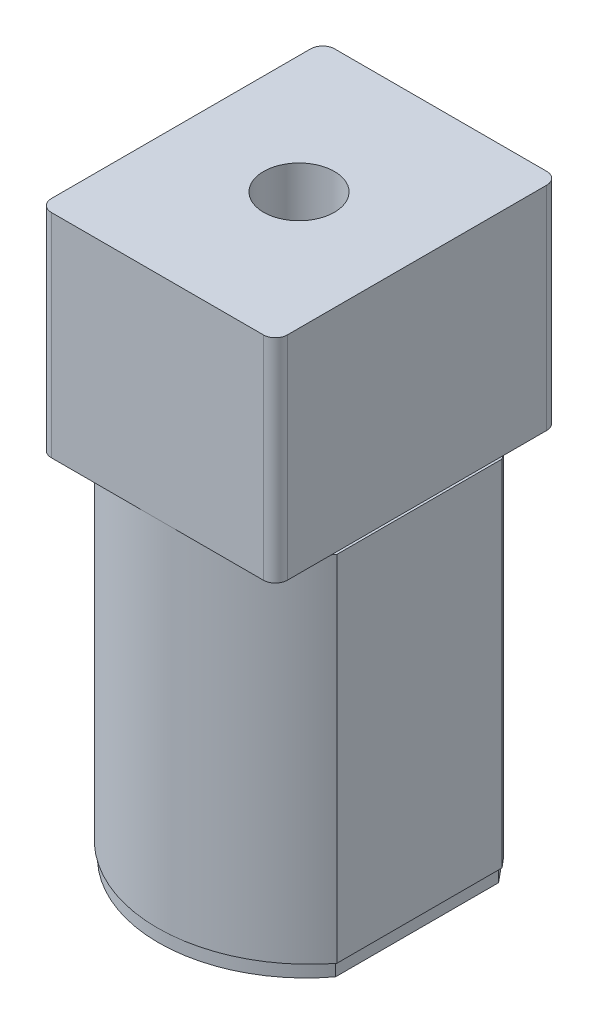
ISO-10303-21;
HEADER;
FILE_DESCRIPTION(('STEP AP214'),'2;1');
FILE_NAME('part.step','',(''),(''),'','','');
FILE_SCHEMA(('AUTOMOTIVE_DESIGN { 1 0 10303 214 1 1 1 1 }'));
ENDSEC;
DATA;
#1=APPLICATION_CONTEXT('core data for automotive mechanical design processes');
#2=APPLICATION_PROTOCOL_DEFINITION('international standard','automotive_design',2000,#1);
#3=PRODUCT_CONTEXT('',#1,'mechanical');
#4=PRODUCT('Part','Part','',(#3));
#5=PRODUCT_RELATED_PRODUCT_CATEGORY('part','',(#4));
#6=PRODUCT_DEFINITION_FORMATION('','',#4);
#7=PRODUCT_DEFINITION_CONTEXT('part definition',#1,'design');
#8=PRODUCT_DEFINITION('design','',#6,#7);
#9=PRODUCT_DEFINITION_SHAPE('','',#8);
#10=(LENGTH_UNIT() NAMED_UNIT(*) SI_UNIT(.MILLI.,.METRE.));
#11=(NAMED_UNIT(*) PLANE_ANGLE_UNIT() SI_UNIT($,.RADIAN.));
#12=(NAMED_UNIT(*) SI_UNIT($,.STERADIAN.) SOLID_ANGLE_UNIT());
#13=UNCERTAINTY_MEASURE_WITH_UNIT(LENGTH_MEASURE(1.E-05),#10,'distance_accuracy_value','');
#14=(GEOMETRIC_REPRESENTATION_CONTEXT(3) GLOBAL_UNCERTAINTY_ASSIGNED_CONTEXT((#13)) GLOBAL_UNIT_ASSIGNED_CONTEXT((#10,
#11,#12)) REPRESENTATION_CONTEXT('',''));
#15=CARTESIAN_POINT('',(0.,0.,0.));
#16=DIRECTION('',(0.,0.,1.));
#17=DIRECTION('',(1.,0.,0.));
#18=AXIS2_PLACEMENT_3D('',#15,#16,#17);
#19=CARTESIAN_POINT('',(0.,15.,0.));
#20=DIRECTION('',(0.,1.,0.));
#21=DIRECTION('',(0.,0.,1.));
#22=AXIS2_PLACEMENT_3D('',#19,#20,#21);
#23=PLANE('',#22);
#24=DIRECTION('',(0.,0.,-1.));
#25=VECTOR('',#24,1.);
#26=CARTESIAN_POINT('',(5.,15.,6.));
#27=LINE('',#26,#25);
#28=CARTESIAN_POINT('',(5.,15.,3.62578174992238));
#29=VERTEX_POINT('',#28);
#30=CARTESIAN_POINT('',(5.,15.,-3.62578174992237));
#31=VERTEX_POINT('',#30);
#32=EDGE_CURVE('E223',#29,#31,#27,.T.);
#33=ORIENTED_EDGE('',*,*,#32,.F.);
#34=CARTESIAN_POINT('',(0.,15.,-0.452));
#35=DIRECTION('',(0.,1.,0.));
#36=DIRECTION('',(0.,0.,1.));
#37=AXIS2_PLACEMENT_3D('',#34,#35,#36);
#38=CIRCLE('',#37,6.452);
#39=CARTESIAN_POINT('',(5.1,15.,3.5));
#40=VERTEX_POINT('',#39);
#41=EDGE_CURVE('E236',#29,#40,#38,.T.);
#42=ORIENTED_EDGE('',*,*,#41,.T.);
#43=DIRECTION('',(0.,0.,-1.));
#44=VECTOR('',#43,1.);
#45=CARTESIAN_POINT('',(5.1,15.,0.));
#46=LINE('',#45,#44);
#47=CARTESIAN_POINT('',(5.1,15.,-3.5));
#48=VERTEX_POINT('',#47);
#49=EDGE_CURVE('E234',#40,#48,#46,.T.);
#50=ORIENTED_EDGE('',*,*,#49,.T.);
#51=CARTESIAN_POINT('',(0.,15.,0.451999999999997));
#52=DIRECTION('',(0.,1.,0.));
#53=DIRECTION('',(0.,0.,1.));
#54=AXIS2_PLACEMENT_3D('',#51,#52,#53);
#55=CIRCLE('',#54,6.452);
#56=EDGE_CURVE('E239',#31,#48,#55,.F.);
#57=ORIENTED_EDGE('',*,*,#56,.F.);
#58=EDGE_LOOP('',(#33,#42,#50,#57));
#59=FACE_BOUND('',#58,.T.);
#60=ADVANCED_FACE('F37',(#59),#23,.T.);
#61=CARTESIAN_POINT('',(0.,15.,-0.452));
#62=DIRECTION('',(0.,-1.,0.));
#63=DIRECTION('',(0.,0.,-1.));
#64=AXIS2_PLACEMENT_3D('',#61,#62,#63);
#65=CYLINDRICAL_SURFACE('',#64,6.452);
#66=CARTESIAN_POINT('',(0.,0.,-0.452));
#67=DIRECTION('',(0.,1.,0.));
#68=DIRECTION('',(0.,0.,1.));
#69=AXIS2_PLACEMENT_3D('',#66,#67,#68);
#70=CIRCLE('',#69,6.452);
#71=CARTESIAN_POINT('',(-5.1,0.,3.5));
#72=VERTEX_POINT('',#71);
#73=CARTESIAN_POINT('',(5.1,0.,3.5));
#74=VERTEX_POINT('',#73);
#75=EDGE_CURVE('E219',#72,#74,#70,.T.);
#76=ORIENTED_EDGE('',*,*,#75,.T.);
#77=DIRECTION('',(0.,-1.,0.));
#78=VECTOR('',#77,1.);
#79=CARTESIAN_POINT('',(5.1,15.,3.5));
#80=LINE('',#79,#78);
#81=EDGE_CURVE('E264',#40,#74,#80,.T.);
#82=ORIENTED_EDGE('',*,*,#81,.F.);
#83=ORIENTED_EDGE('',*,*,#41,.F.);
#84=CARTESIAN_POINT('',(0.,15.,6.));
#85=VERTEX_POINT('',#84);
#86=EDGE_CURVE('E353',#85,#29,#38,.T.);
#87=ORIENTED_EDGE('',*,*,#86,.F.);
#88=CARTESIAN_POINT('',(-5.,15.,3.62578174992237));
#89=VERTEX_POINT('',#88);
#90=EDGE_CURVE('E235',#89,#85,#38,.T.);
#91=ORIENTED_EDGE('',*,*,#90,.F.);
#92=CARTESIAN_POINT('',(-5.1,15.,3.5));
#93=VERTEX_POINT('',#92);
#94=EDGE_CURVE('E232',#93,#89,#38,.T.);
#95=ORIENTED_EDGE('',*,*,#94,.F.);
#96=DIRECTION('',(0.,-1.,0.));
#97=VECTOR('',#96,1.);
#98=CARTESIAN_POINT('',(-5.1,15.,3.5));
#99=LINE('',#98,#97);
#100=EDGE_CURVE('E247',#93,#72,#99,.T.);
#101=ORIENTED_EDGE('',*,*,#100,.T.);
#102=EDGE_LOOP('',(#76,#82,#83,#87,#91,#95,#101));
#103=FACE_BOUND('',#102,.T.);
#104=ADVANCED_FACE('F364',(#103),#65,.T.);
#105=CARTESIAN_POINT('',(5.1,15.,0.));
#106=DIRECTION('',(-1.,0.,0.));
#107=DIRECTION('',(0.,0.,1.));
#108=AXIS2_PLACEMENT_3D('',#105,#106,#107);
#109=PLANE('',#108);
#110=DIRECTION('',(0.,0.,-1.));
#111=VECTOR('',#110,1.);
#112=CARTESIAN_POINT('',(5.1,0.,0.));
#113=LINE('',#112,#111);
#114=CARTESIAN_POINT('',(5.1,0.,-3.5));
#115=VERTEX_POINT('',#114);
#116=EDGE_CURVE('E250',#74,#115,#113,.T.);
#117=ORIENTED_EDGE('',*,*,#116,.T.);
#118=DIRECTION('',(0.,-1.,0.));
#119=VECTOR('',#118,1.);
#120=CARTESIAN_POINT('',(5.1,15.,-3.5));
#121=LINE('',#120,#119);
#122=EDGE_CURVE('E262',#48,#115,#121,.T.);
#123=ORIENTED_EDGE('',*,*,#122,.F.);
#124=ORIENTED_EDGE('',*,*,#49,.F.);
#125=ORIENTED_EDGE('',*,*,#81,.T.);
#126=EDGE_LOOP('',(#117,#123,#124,#125));
#127=FACE_BOUND('',#126,.T.);
#128=ADVANCED_FACE('F363',(#127),#109,.F.);
#129=CARTESIAN_POINT('',(0.,15.,0.451999999999997));
#130=DIRECTION('',(0.,-1.,0.));
#131=DIRECTION('',(0.,0.,-1.));
#132=AXIS2_PLACEMENT_3D('',#129,#130,#131);
#133=CYLINDRICAL_SURFACE('',#132,6.452);
#134=CARTESIAN_POINT('',(0.,0.,0.451999999999997));
#135=DIRECTION('',(0.,1.,0.));
#136=DIRECTION('',(0.,0.,1.));
#137=AXIS2_PLACEMENT_3D('',#134,#135,#136);
#138=CIRCLE('',#137,6.452);
#139=CARTESIAN_POINT('',(-5.1,0.,-3.5));
#140=VERTEX_POINT('',#139);
#141=EDGE_CURVE('E253',#140,#115,#138,.F.);
#142=ORIENTED_EDGE('',*,*,#141,.F.);
#143=DIRECTION('',(0.,-1.,0.));
#144=VECTOR('',#143,1.);
#145=CARTESIAN_POINT('',(-5.1,15.,-3.5));
#146=LINE('',#145,#144);
#147=CARTESIAN_POINT('',(-5.1,15.,-3.5));
#148=VERTEX_POINT('',#147);
#149=EDGE_CURVE('E260',#148,#140,#146,.T.);
#150=ORIENTED_EDGE('',*,*,#149,.F.);
#151=CARTESIAN_POINT('',(-5.,15.,-3.62578174992237));
#152=VERTEX_POINT('',#151);
#153=EDGE_CURVE('E240',#148,#152,#55,.F.);
#154=ORIENTED_EDGE('',*,*,#153,.T.);
#155=CARTESIAN_POINT('',(0.,15.,-6.));
#156=VERTEX_POINT('',#155);
#157=EDGE_CURVE('E244',#152,#156,#55,.F.);
#158=ORIENTED_EDGE('',*,*,#157,.T.);
#159=EDGE_CURVE('E379',#156,#31,#55,.F.);
#160=ORIENTED_EDGE('',*,*,#159,.T.);
#161=ORIENTED_EDGE('',*,*,#56,.T.);
#162=ORIENTED_EDGE('',*,*,#122,.T.);
#163=EDGE_LOOP('',(#142,#150,#154,#158,#160,#161,#162));
#164=FACE_BOUND('',#163,.T.);
#165=ADVANCED_FACE('F376',(#164),#133,.T.);
#166=CARTESIAN_POINT('',(-5.1,15.,0.));
#167=DIRECTION('',(-1.,0.,0.));
#168=DIRECTION('',(0.,0.,1.));
#169=AXIS2_PLACEMENT_3D('',#166,#167,#168);
#170=PLANE('',#169);
#171=DIRECTION('',(0.,0.,-1.));
#172=VECTOR('',#171,1.);
#173=CARTESIAN_POINT('',(-5.1,0.,0.));
#174=LINE('',#173,#172);
#175=EDGE_CURVE('E256',#72,#140,#174,.T.);
#176=ORIENTED_EDGE('',*,*,#175,.F.);
#177=ORIENTED_EDGE('',*,*,#100,.F.);
#178=DIRECTION('',(0.,0.,-1.));
#179=VECTOR('',#178,1.);
#180=CARTESIAN_POINT('',(-5.1,15.,0.));
#181=LINE('',#180,#179);
#182=EDGE_CURVE('E243',#93,#148,#181,.T.);
#183=ORIENTED_EDGE('',*,*,#182,.T.);
#184=ORIENTED_EDGE('',*,*,#149,.T.);
#185=EDGE_LOOP('',(#176,#177,#183,#184));
#186=FACE_BOUND('',#185,.T.);
#187=ADVANCED_FACE('F371',(#186),#170,.T.);
#188=DIRECTION('',(0.,0.,1.));
#189=VECTOR('',#188,1.);
#190=CARTESIAN_POINT('',(-5.,15.,6.));
#191=LINE('',#190,#189);
#192=EDGE_CURVE('E230',#152,#89,#191,.T.);
#193=ORIENTED_EDGE('',*,*,#192,.F.);
#194=ORIENTED_EDGE('',*,*,#153,.F.);
#195=ORIENTED_EDGE('',*,*,#182,.F.);
#196=ORIENTED_EDGE('',*,*,#94,.T.);
#197=EDGE_LOOP('',(#193,#194,#195,#196));
#198=FACE_BOUND('',#197,.T.);
#199=ADVANCED_FACE('F385',(#198),#23,.T.);
#200=CARTESIAN_POINT('',(0.,0.,0.));
#201=DIRECTION('',(0.,1.,0.));
#202=DIRECTION('',(0.,0.,1.));
#203=AXIS2_PLACEMENT_3D('',#200,#201,#202);
#204=PLANE('',#203);
#205=DIRECTION('',(0.,0.,1.));
#206=VECTOR('',#205,1.);
#207=CARTESIAN_POINT('',(-5.,0.,0.));
#208=LINE('',#207,#206);
#209=CARTESIAN_POINT('',(-5.,0.,-3.45));
#210=VERTEX_POINT('',#209);
#211=CARTESIAN_POINT('',(-5.,0.,3.45));
#212=VERTEX_POINT('',#211);
#213=EDGE_CURVE('E52',#210,#212,#208,.T.);
#214=ORIENTED_EDGE('',*,*,#213,.T.);
#215=CARTESIAN_POINT('',(0.,0.,-0.299999999999965));
#216=DIRECTION('',(0.,-1.,0.));
#217=DIRECTION('',(0.,0.,-1.));
#218=AXIS2_PLACEMENT_3D('',#215,#216,#217);
#219=CIRCLE('',#218,6.24999999999998);
#220=CARTESIAN_POINT('',(5.,0.,3.45));
#221=VERTEX_POINT('',#220);
#222=EDGE_CURVE('E171',#212,#221,#219,.F.);
#223=ORIENTED_EDGE('',*,*,#222,.T.);
#224=DIRECTION('',(0.,0.,1.));
#225=VECTOR('',#224,1.);
#226=CARTESIAN_POINT('',(5.,0.,0.));
#227=LINE('',#226,#225);
#228=CARTESIAN_POINT('',(5.,0.,-3.45));
#229=VERTEX_POINT('',#228);
#230=EDGE_CURVE('E184',#229,#221,#227,.T.);
#231=ORIENTED_EDGE('',*,*,#230,.F.);
#232=CARTESIAN_POINT('',(0.,0.,0.299999999999966));
#233=DIRECTION('',(0.,-1.,0.));
#234=DIRECTION('',(0.,0.,-1.));
#235=AXIS2_PLACEMENT_3D('',#232,#233,#234);
#236=CIRCLE('',#235,6.24999999999998);
#237=EDGE_CURVE('E57',#210,#229,#236,.T.);
#238=ORIENTED_EDGE('',*,*,#237,.F.);
#239=EDGE_LOOP('',(#214,#223,#231,#238));
#240=FACE_BOUND('',#239,.T.);
#241=ORIENTED_EDGE('',*,*,#75,.F.);
#242=ORIENTED_EDGE('',*,*,#175,.T.);
#243=ORIENTED_EDGE('',*,*,#141,.T.);
#244=ORIENTED_EDGE('',*,*,#116,.F.);
#245=EDGE_LOOP('',(#241,#242,#243,#244));
#246=FACE_BOUND('',#245,.T.);
#247=ADVANCED_FACE('F369',(#240,#246),#204,.F.);
#248=CARTESIAN_POINT('',(0.,15.,0.));
#249=DIRECTION('',(0.,-1.,0.));
#250=DIRECTION('',(0.,0.,-1.));
#251=AXIS2_PLACEMENT_3D('',#248,#249,#250);
#252=PLANE('',#251);
#253=DIRECTION('',(1.,0.,0.));
#254=VECTOR('',#253,1.);
#255=CARTESIAN_POINT('',(-5.,15.,6.));
#256=LINE('',#255,#254);
#257=CARTESIAN_POINT('',(-4.492,15.,6.));
#258=VERTEX_POINT('',#257);
#259=EDGE_CURVE('E210',#258,#85,#256,.T.);
#260=ORIENTED_EDGE('',*,*,#259,.F.);
#261=CARTESIAN_POINT('',(-4.492,15.,5.492));
#262=DIRECTION('',(0.,-1.,0.));
#263=DIRECTION('',(0.,0.,-1.));
#264=AXIS2_PLACEMENT_3D('',#261,#262,#263);
#265=CIRCLE('',#264,0.508);
#266=CARTESIAN_POINT('',(-5.,15.,5.492));
#267=VERTEX_POINT('',#266);
#268=EDGE_CURVE('E272',#258,#267,#265,.T.);
#269=ORIENTED_EDGE('',*,*,#268,.T.);
#270=EDGE_CURVE('E226',#89,#267,#191,.T.);
#271=ORIENTED_EDGE('',*,*,#270,.F.);
#272=ORIENTED_EDGE('',*,*,#90,.T.);
#273=EDGE_LOOP('',(#260,#269,#271,#272));
#274=FACE_BOUND('',#273,.T.);
#275=ADVANCED_FACE('F387',(#274),#252,.T.);
#276=CARTESIAN_POINT('',(-5.,15.,-5.492));
#277=VERTEX_POINT('',#276);
#278=EDGE_CURVE('E227',#277,#152,#191,.T.);
#279=ORIENTED_EDGE('',*,*,#278,.F.);
#280=CARTESIAN_POINT('',(-4.492,15.,-5.492));
#281=DIRECTION('',(0.,-1.,0.));
#282=DIRECTION('',(0.,0.,-1.));
#283=AXIS2_PLACEMENT_3D('',#280,#281,#282);
#284=CIRCLE('',#283,0.508);
#285=CARTESIAN_POINT('',(-4.492,15.,-6.));
#286=VERTEX_POINT('',#285);
#287=EDGE_CURVE('E11',#277,#286,#284,.T.);
#288=ORIENTED_EDGE('',*,*,#287,.T.);
#289=DIRECTION('',(-1.,0.,0.));
#290=VECTOR('',#289,1.);
#291=CARTESIAN_POINT('',(-5.,15.,-6.));
#292=LINE('',#291,#290);
#293=EDGE_CURVE('E222',#156,#286,#292,.T.);
#294=ORIENTED_EDGE('',*,*,#293,.F.);
#295=ORIENTED_EDGE('',*,*,#157,.F.);
#296=EDGE_LOOP('',(#279,#288,#294,#295));
#297=FACE_BOUND('',#296,.T.);
#298=ADVANCED_FACE('F382',(#297),#252,.T.);
#299=CARTESIAN_POINT('',(4.492,15.,-6.));
#300=VERTEX_POINT('',#299);
#301=EDGE_CURVE('E224',#300,#156,#292,.T.);
#302=ORIENTED_EDGE('',*,*,#301,.F.);
#303=CARTESIAN_POINT('',(4.492,15.,-5.492));
#304=DIRECTION('',(0.,-1.,0.));
#305=DIRECTION('',(0.,0.,-1.));
#306=AXIS2_PLACEMENT_3D('',#303,#304,#305);
#307=CIRCLE('',#306,0.508);
#308=CARTESIAN_POINT('',(5.,15.,-5.492));
#309=VERTEX_POINT('',#308);
#310=EDGE_CURVE('E45',#300,#309,#307,.T.);
#311=ORIENTED_EDGE('',*,*,#310,.T.);
#312=EDGE_CURVE('E174',#31,#309,#27,.T.);
#313=ORIENTED_EDGE('',*,*,#312,.F.);
#314=ORIENTED_EDGE('',*,*,#159,.F.);
#315=EDGE_LOOP('',(#302,#311,#313,#314));
#316=FACE_BOUND('',#315,.T.);
#317=ADVANCED_FACE('F302',(#316),#252,.T.);
#318=CARTESIAN_POINT('',(5.,24.,6.));
#319=DIRECTION('',(-1.,0.,0.));
#320=DIRECTION('',(0.,0.,1.));
#321=AXIS2_PLACEMENT_3D('',#318,#319,#320);
#322=PLANE('',#321);
#323=DIRECTION('',(0.,0.,-1.));
#324=VECTOR('',#323,1.);
#325=CARTESIAN_POINT('',(5.,24.,6.));
#326=LINE('',#325,#324);
#327=CARTESIAN_POINT('',(5.,24.,5.492));
#328=VERTEX_POINT('',#327);
#329=CARTESIAN_POINT('',(5.,24.,-5.492));
#330=VERTEX_POINT('',#329);
#331=EDGE_CURVE('E206',#328,#330,#326,.T.);
#332=ORIENTED_EDGE('',*,*,#331,.F.);
#333=DIRECTION('',(0.,-1.,0.));
#334=VECTOR('',#333,1.);
#335=CARTESIAN_POINT('',(5.,24.,5.492));
#336=LINE('',#335,#334);
#337=CARTESIAN_POINT('',(5.,15.,5.492));
#338=VERTEX_POINT('',#337);
#339=EDGE_CURVE('E289',#328,#338,#336,.T.);
#340=ORIENTED_EDGE('',*,*,#339,.T.);
#341=EDGE_CURVE('E220',#338,#29,#27,.T.);
#342=ORIENTED_EDGE('',*,*,#341,.T.);
#343=ORIENTED_EDGE('',*,*,#32,.T.);
#344=ORIENTED_EDGE('',*,*,#312,.T.);
#345=DIRECTION('',(0.,-1.,0.));
#346=VECTOR('',#345,1.);
#347=CARTESIAN_POINT('',(5.,24.,-5.492));
#348=LINE('',#347,#346);
#349=EDGE_CURVE('E287',#309,#330,#348,.F.);
#350=ORIENTED_EDGE('',*,*,#349,.T.);
#351=EDGE_LOOP('',(#332,#340,#342,#343,#344,#350));
#352=FACE_BOUND('',#351,.T.);
#353=ADVANCED_FACE('F310',(#352),#322,.F.);
#354=CARTESIAN_POINT('',(-5.,24.,-6.));
#355=DIRECTION('',(0.,0.,1.));
#356=DIRECTION('',(1.,0.,0.));
#357=AXIS2_PLACEMENT_3D('',#354,#355,#356);
#358=PLANE('',#357);
#359=DIRECTION('',(-1.,0.,0.));
#360=VECTOR('',#359,1.);
#361=CARTESIAN_POINT('',(-5.,24.,-6.));
#362=LINE('',#361,#360);
#363=CARTESIAN_POINT('',(4.492,24.,-6.));
#364=VERTEX_POINT('',#363);
#365=CARTESIAN_POINT('',(-4.492,24.,-6.));
#366=VERTEX_POINT('',#365);
#367=EDGE_CURVE('E209',#364,#366,#362,.T.);
#368=ORIENTED_EDGE('',*,*,#367,.F.);
#369=DIRECTION('',(0.,-1.,0.));
#370=VECTOR('',#369,1.);
#371=CARTESIAN_POINT('',(4.492,24.,-6.));
#372=LINE('',#371,#370);
#373=EDGE_CURVE('E296',#364,#300,#372,.T.);
#374=ORIENTED_EDGE('',*,*,#373,.T.);
#375=ORIENTED_EDGE('',*,*,#301,.T.);
#376=ORIENTED_EDGE('',*,*,#293,.T.);
#377=DIRECTION('',(0.,-1.,0.));
#378=VECTOR('',#377,1.);
#379=CARTESIAN_POINT('',(-4.492,24.,-6.));
#380=LINE('',#379,#378);
#381=EDGE_CURVE('E294',#286,#366,#380,.F.);
#382=ORIENTED_EDGE('',*,*,#381,.T.);
#383=EDGE_LOOP('',(#368,#374,#375,#376,#382));
#384=FACE_BOUND('',#383,.T.);
#385=ADVANCED_FACE('F319',(#384),#358,.F.);
#386=CARTESIAN_POINT('',(-5.,24.,6.));
#387=DIRECTION('',(1.,0.,0.));
#388=DIRECTION('',(0.,0.,-1.));
#389=AXIS2_PLACEMENT_3D('',#386,#387,#388);
#390=PLANE('',#389);
#391=ORIENTED_EDGE('',*,*,#270,.T.);
#392=DIRECTION('',(0.,-1.,0.));
#393=VECTOR('',#392,1.);
#394=CARTESIAN_POINT('',(-5.,24.,5.492));
#395=LINE('',#394,#393);
#396=CARTESIAN_POINT('',(-5.,24.,5.492));
#397=VERTEX_POINT('',#396);
#398=EDGE_CURVE('E277',#267,#397,#395,.F.);
#399=ORIENTED_EDGE('',*,*,#398,.T.);
#400=DIRECTION('',(0.,0.,1.));
#401=VECTOR('',#400,1.);
#402=CARTESIAN_POINT('',(-5.,24.,6.));
#403=LINE('',#402,#401);
#404=CARTESIAN_POINT('',(-5.,24.,-5.492));
#405=VERTEX_POINT('',#404);
#406=EDGE_CURVE('E213',#405,#397,#403,.T.);
#407=ORIENTED_EDGE('',*,*,#406,.F.);
#408=DIRECTION('',(0.,-1.,0.));
#409=VECTOR('',#408,1.);
#410=CARTESIAN_POINT('',(-5.,24.,-5.492));
#411=LINE('',#410,#409);
#412=EDGE_CURVE('E274',#405,#277,#411,.T.);
#413=ORIENTED_EDGE('',*,*,#412,.T.);
#414=ORIENTED_EDGE('',*,*,#278,.T.);
#415=ORIENTED_EDGE('',*,*,#192,.T.);
#416=EDGE_LOOP('',(#391,#399,#407,#413,#414,#415));
#417=FACE_BOUND('',#416,.T.);
#418=ADVANCED_FACE('F329',(#417),#390,.F.);
#419=CARTESIAN_POINT('',(-5.,24.,6.));
#420=DIRECTION('',(0.,0.,-1.));
#421=DIRECTION('',(-1.,0.,0.));
#422=AXIS2_PLACEMENT_3D('',#419,#420,#421);
#423=PLANE('',#422);
#424=DIRECTION('',(1.,0.,0.));
#425=VECTOR('',#424,1.);
#426=CARTESIAN_POINT('',(-5.,24.,6.));
#427=LINE('',#426,#425);
#428=CARTESIAN_POINT('',(-4.492,24.,6.));
#429=VERTEX_POINT('',#428);
#430=CARTESIAN_POINT('',(4.492,24.,6.));
#431=VERTEX_POINT('',#430);
#432=EDGE_CURVE('E216',#429,#431,#427,.T.);
#433=ORIENTED_EDGE('',*,*,#432,.F.);
#434=DIRECTION('',(0.,-1.,0.));
#435=VECTOR('',#434,1.);
#436=CARTESIAN_POINT('',(-4.492,24.,6.));
#437=LINE('',#436,#435);
#438=EDGE_CURVE('E269',#429,#258,#437,.T.);
#439=ORIENTED_EDGE('',*,*,#438,.T.);
#440=ORIENTED_EDGE('',*,*,#259,.T.);
#441=CARTESIAN_POINT('',(4.492,15.,6.));
#442=VERTEX_POINT('',#441);
#443=EDGE_CURVE('E229',#85,#442,#256,.T.);
#444=ORIENTED_EDGE('',*,*,#443,.T.);
#445=DIRECTION('',(0.,-1.,0.));
#446=VECTOR('',#445,1.);
#447=CARTESIAN_POINT('',(4.492,24.,6.));
#448=LINE('',#447,#446);
#449=EDGE_CURVE('E267',#442,#431,#448,.F.);
#450=ORIENTED_EDGE('',*,*,#449,.T.);
#451=EDGE_LOOP('',(#433,#439,#440,#444,#450));
#452=FACE_BOUND('',#451,.T.);
#453=ADVANCED_FACE('F340',(#452),#423,.F.);
#454=CARTESIAN_POINT('',(0.,24.,0.));
#455=DIRECTION('',(0.,-1.,0.));
#456=DIRECTION('',(0.,0.,-1.));
#457=AXIS2_PLACEMENT_3D('',#454,#455,#456);
#458=PLANE('',#457);
#459=CARTESIAN_POINT('',(0.,24.,0.));
#460=DIRECTION('',(0.,1.,0.));
#461=DIRECTION('',(0.,0.,1.));
#462=AXIS2_PLACEMENT_3D('',#459,#460,#461);
#463=CIRCLE('',#462,1.5);
#464=CARTESIAN_POINT('',(0.,24.,1.5));
#465=VERTEX_POINT('',#464);
#466=EDGE_CURVE('E443',#465,#465,#463,.T.);
#467=ORIENTED_EDGE('',*,*,#466,.F.);
#468=EDGE_LOOP('',(#467));
#469=FACE_BOUND('',#468,.T.);
#470=ORIENTED_EDGE('',*,*,#406,.T.);
#471=CARTESIAN_POINT('',(-4.492,24.,5.492));
#472=DIRECTION('',(0.,-1.,0.));
#473=DIRECTION('',(0.,0.,-1.));
#474=AXIS2_PLACEMENT_3D('',#471,#472,#473);
#475=CIRCLE('',#474,0.508);
#476=EDGE_CURVE('E285',#397,#429,#475,.F.);
#477=ORIENTED_EDGE('',*,*,#476,.T.);
#478=ORIENTED_EDGE('',*,*,#432,.T.);
#479=CARTESIAN_POINT('',(4.492,24.,5.492));
#480=DIRECTION('',(0.,-1.,0.));
#481=DIRECTION('',(0.,0.,-1.));
#482=AXIS2_PLACEMENT_3D('',#479,#480,#481);
#483=CIRCLE('',#482,0.508);
#484=EDGE_CURVE('E283',#431,#328,#483,.F.);
#485=ORIENTED_EDGE('',*,*,#484,.T.);
#486=ORIENTED_EDGE('',*,*,#331,.T.);
#487=CARTESIAN_POINT('',(4.492,24.,-5.492));
#488=DIRECTION('',(0.,-1.,0.));
#489=DIRECTION('',(0.,0.,-1.));
#490=AXIS2_PLACEMENT_3D('',#487,#488,#489);
#491=CIRCLE('',#490,0.508);
#492=EDGE_CURVE('E281',#330,#364,#491,.F.);
#493=ORIENTED_EDGE('',*,*,#492,.T.);
#494=ORIENTED_EDGE('',*,*,#367,.T.);
#495=CARTESIAN_POINT('',(-4.492,24.,-5.492));
#496=DIRECTION('',(0.,-1.,0.));
#497=DIRECTION('',(0.,0.,-1.));
#498=AXIS2_PLACEMENT_3D('',#495,#496,#497);
#499=CIRCLE('',#498,0.508);
#500=EDGE_CURVE('E279',#366,#405,#499,.F.);
#501=ORIENTED_EDGE('',*,*,#500,.T.);
#502=EDGE_LOOP('',(#470,#477,#478,#485,#486,#493,#494,#501));
#503=FACE_BOUND('',#502,.T.);
#504=ADVANCED_FACE('F316',(#469,#503),#458,.F.);
#505=ORIENTED_EDGE('',*,*,#341,.F.);
#506=CARTESIAN_POINT('',(4.492,15.,5.492));
#507=DIRECTION('',(0.,-1.,0.));
#508=DIRECTION('',(0.,0.,-1.));
#509=AXIS2_PLACEMENT_3D('',#506,#507,#508);
#510=CIRCLE('',#509,0.508);
#511=EDGE_CURVE('E292',#338,#442,#510,.T.);
#512=ORIENTED_EDGE('',*,*,#511,.T.);
#513=ORIENTED_EDGE('',*,*,#443,.F.);
#514=ORIENTED_EDGE('',*,*,#86,.T.);
#515=EDGE_LOOP('',(#505,#512,#513,#514));
#516=FACE_BOUND('',#515,.T.);
#517=ADVANCED_FACE('F351',(#516),#252,.T.);
#518=CARTESIAN_POINT('',(-4.492,24.,5.492));
#519=DIRECTION('',(0.,-1.,0.));
#520=DIRECTION('',(0.,0.,-1.));
#521=AXIS2_PLACEMENT_3D('',#518,#519,#520);
#522=CYLINDRICAL_SURFACE('',#521,0.508);
#523=ORIENTED_EDGE('',*,*,#476,.F.);
#524=ORIENTED_EDGE('',*,*,#398,.F.);
#525=ORIENTED_EDGE('',*,*,#268,.F.);
#526=ORIENTED_EDGE('',*,*,#438,.F.);
#527=EDGE_LOOP('',(#523,#524,#525,#526));
#528=FACE_BOUND('',#527,.T.);
#529=ADVANCED_FACE('F335',(#528),#522,.T.);
#530=CARTESIAN_POINT('',(4.492,24.,5.492));
#531=DIRECTION('',(0.,-1.,0.));
#532=DIRECTION('',(0.,0.,-1.));
#533=AXIS2_PLACEMENT_3D('',#530,#531,#532);
#534=CYLINDRICAL_SURFACE('',#533,0.508);
#535=ORIENTED_EDGE('',*,*,#484,.F.);
#536=ORIENTED_EDGE('',*,*,#449,.F.);
#537=ORIENTED_EDGE('',*,*,#511,.F.);
#538=ORIENTED_EDGE('',*,*,#339,.F.);
#539=EDGE_LOOP('',(#535,#536,#537,#538));
#540=FACE_BOUND('',#539,.T.);
#541=ADVANCED_FACE('F346',(#540),#534,.T.);
#542=CARTESIAN_POINT('',(4.492,24.,-5.492));
#543=DIRECTION('',(0.,-1.,0.));
#544=DIRECTION('',(0.,0.,-1.));
#545=AXIS2_PLACEMENT_3D('',#542,#543,#544);
#546=CYLINDRICAL_SURFACE('',#545,0.508);
#547=ORIENTED_EDGE('',*,*,#492,.F.);
#548=ORIENTED_EDGE('',*,*,#349,.F.);
#549=ORIENTED_EDGE('',*,*,#310,.F.);
#550=ORIENTED_EDGE('',*,*,#373,.F.);
#551=EDGE_LOOP('',(#547,#548,#549,#550));
#552=FACE_BOUND('',#551,.T.);
#553=ADVANCED_FACE('F313',(#552),#546,.T.);
#554=CARTESIAN_POINT('',(-4.492,24.,-5.492));
#555=DIRECTION('',(0.,-1.,0.));
#556=DIRECTION('',(0.,0.,-1.));
#557=AXIS2_PLACEMENT_3D('',#554,#555,#556);
#558=CYLINDRICAL_SURFACE('',#557,0.508);
#559=ORIENTED_EDGE('',*,*,#500,.F.);
#560=ORIENTED_EDGE('',*,*,#381,.F.);
#561=ORIENTED_EDGE('',*,*,#287,.F.);
#562=ORIENTED_EDGE('',*,*,#412,.F.);
#563=EDGE_LOOP('',(#559,#560,#561,#562));
#564=FACE_BOUND('',#563,.T.);
#565=ADVANCED_FACE('F39',(#564),#558,.T.);
#566=CARTESIAN_POINT('',(0.,-0.57,-0.299999999999965));
#567=DIRECTION('',(0.,1.,0.));
#568=DIRECTION('',(0.,0.,1.));
#569=AXIS2_PLACEMENT_3D('',#566,#567,#568);
#570=CYLINDRICAL_SURFACE('',#569,6.24999999999998);
#571=ORIENTED_EDGE('',*,*,#222,.F.);
#572=DIRECTION('',(0.,1.,0.));
#573=VECTOR('',#572,1.);
#574=CARTESIAN_POINT('',(-5.,-0.57,3.45));
#575=LINE('',#574,#573);
#576=CARTESIAN_POINT('',(-5.,-0.57,3.45));
#577=VERTEX_POINT('',#576);
#578=EDGE_CURVE('E166',#577,#212,#575,.T.);
#579=ORIENTED_EDGE('',*,*,#578,.F.);
#580=CARTESIAN_POINT('',(0.,-0.57,-0.299999999999965));
#581=DIRECTION('',(0.,-1.,0.));
#582=DIRECTION('',(0.,0.,-1.));
#583=AXIS2_PLACEMENT_3D('',#580,#581,#582);
#584=CIRCLE('',#583,6.24999999999998);
#585=CARTESIAN_POINT('',(5.,-0.57,3.45));
#586=VERTEX_POINT('',#585);
#587=EDGE_CURVE('E170',#577,#586,#584,.F.);
#588=ORIENTED_EDGE('',*,*,#587,.T.);
#589=DIRECTION('',(0.,1.,0.));
#590=VECTOR('',#589,1.);
#591=CARTESIAN_POINT('',(5.,-0.57,3.45));
#592=LINE('',#591,#590);
#593=EDGE_CURVE('E194',#586,#221,#592,.T.);
#594=ORIENTED_EDGE('',*,*,#593,.T.);
#595=EDGE_LOOP('',(#571,#579,#588,#594));
#596=FACE_BOUND('',#595,.T.);
#597=ADVANCED_FACE('F168',(#596),#570,.T.);
#598=CARTESIAN_POINT('',(-5.,-0.57,0.));
#599=DIRECTION('',(-1.,0.,0.));
#600=DIRECTION('',(0.,0.,1.));
#601=AXIS2_PLACEMENT_3D('',#598,#599,#600);
#602=PLANE('',#601);
#603=ORIENTED_EDGE('',*,*,#213,.F.);
#604=DIRECTION('',(0.,1.,0.));
#605=VECTOR('',#604,1.);
#606=CARTESIAN_POINT('',(-5.,-0.57,-3.45));
#607=LINE('',#606,#605);
#608=CARTESIAN_POINT('',(-5.,-0.57,-3.45));
#609=VERTEX_POINT('',#608);
#610=EDGE_CURVE('E175',#609,#210,#607,.T.);
#611=ORIENTED_EDGE('',*,*,#610,.F.);
#612=DIRECTION('',(0.,0.,1.));
#613=VECTOR('',#612,1.);
#614=CARTESIAN_POINT('',(-5.,-0.57,0.));
#615=LINE('',#614,#613);
#616=EDGE_CURVE('E180',#609,#577,#615,.T.);
#617=ORIENTED_EDGE('',*,*,#616,.T.);
#618=ORIENTED_EDGE('',*,*,#578,.T.);
#619=EDGE_LOOP('',(#603,#611,#617,#618));
#620=FACE_BOUND('',#619,.T.);
#621=ADVANCED_FACE('F186',(#620),#602,.T.);
#622=CARTESIAN_POINT('',(0.,-0.57,0.299999999999966));
#623=DIRECTION('',(0.,1.,0.));
#624=DIRECTION('',(0.,0.,1.));
#625=AXIS2_PLACEMENT_3D('',#622,#623,#624);
#626=CYLINDRICAL_SURFACE('',#625,6.24999999999998);
#627=ORIENTED_EDGE('',*,*,#237,.T.);
#628=DIRECTION('',(0.,1.,0.));
#629=VECTOR('',#628,1.);
#630=CARTESIAN_POINT('',(5.,-0.57,-3.45));
#631=LINE('',#630,#629);
#632=CARTESIAN_POINT('',(5.,-0.57,-3.45));
#633=VERTEX_POINT('',#632);
#634=EDGE_CURVE('E202',#633,#229,#631,.T.);
#635=ORIENTED_EDGE('',*,*,#634,.F.);
#636=CARTESIAN_POINT('',(0.,-0.57,0.299999999999966));
#637=DIRECTION('',(0.,-1.,0.));
#638=DIRECTION('',(0.,0.,-1.));
#639=AXIS2_PLACEMENT_3D('',#636,#637,#638);
#640=CIRCLE('',#639,6.24999999999998);
#641=EDGE_CURVE('E188',#609,#633,#640,.T.);
#642=ORIENTED_EDGE('',*,*,#641,.F.);
#643=ORIENTED_EDGE('',*,*,#610,.T.);
#644=EDGE_LOOP('',(#627,#635,#642,#643));
#645=FACE_BOUND('',#644,.T.);
#646=ADVANCED_FACE('F432',(#645),#626,.T.);
#647=CARTESIAN_POINT('',(5.,-0.57,0.));
#648=DIRECTION('',(-1.,0.,0.));
#649=DIRECTION('',(0.,0.,1.));
#650=AXIS2_PLACEMENT_3D('',#647,#648,#649);
#651=PLANE('',#650);
#652=ORIENTED_EDGE('',*,*,#230,.T.);
#653=ORIENTED_EDGE('',*,*,#593,.F.);
#654=DIRECTION('',(0.,0.,1.));
#655=VECTOR('',#654,1.);
#656=CARTESIAN_POINT('',(5.,-0.57,0.));
#657=LINE('',#656,#655);
#658=EDGE_CURVE('E182',#633,#586,#657,.T.);
#659=ORIENTED_EDGE('',*,*,#658,.F.);
#660=ORIENTED_EDGE('',*,*,#634,.T.);
#661=EDGE_LOOP('',(#652,#653,#659,#660));
#662=FACE_BOUND('',#661,.T.);
#663=ADVANCED_FACE('F458',(#662),#651,.F.);
#664=CARTESIAN_POINT('',(0.,-0.57,0.));
#665=DIRECTION('',(0.,-1.,0.));
#666=DIRECTION('',(0.,0.,-1.));
#667=AXIS2_PLACEMENT_3D('',#664,#665,#666);
#668=PLANE('',#667);
#669=ORIENTED_EDGE('',*,*,#587,.F.);
#670=ORIENTED_EDGE('',*,*,#616,.F.);
#671=ORIENTED_EDGE('',*,*,#641,.T.);
#672=ORIENTED_EDGE('',*,*,#658,.T.);
#673=EDGE_LOOP('',(#669,#670,#671,#672));
#674=FACE_BOUND('',#673,.T.);
#675=ADVANCED_FACE('F179',(#674),#668,.T.);
#676=CARTESIAN_POINT('',(0.,15.048,0.));
#677=DIRECTION('',(0.,1.,0.));
#678=DIRECTION('',(0.,0.,1.));
#679=AXIS2_PLACEMENT_3D('',#676,#677,#678);
#680=CYLINDRICAL_SURFACE('',#679,1.5);
#681=CARTESIAN_POINT('',(0.,15.048,0.));
#682=DIRECTION('',(0.,1.,0.));
#683=DIRECTION('',(0.,0.,1.));
#684=AXIS2_PLACEMENT_3D('',#681,#682,#683);
#685=CIRCLE('',#684,1.5);
#686=CARTESIAN_POINT('',(0.,15.048,1.5));
#687=VERTEX_POINT('',#686);
#688=EDGE_CURVE('E196',#687,#687,#685,.T.);
#689=ORIENTED_EDGE('',*,*,#688,.F.);
#690=EDGE_LOOP('',(#689));
#691=FACE_BOUND('',#690,.T.);
#692=ORIENTED_EDGE('',*,*,#466,.T.);
#693=EDGE_LOOP('',(#692));
#694=FACE_BOUND('',#693,.T.);
#695=ADVANCED_FACE('F451',(#691,#694),#680,.F.);
#696=CARTESIAN_POINT('',(0.,15.048,0.));
#697=DIRECTION('',(0.,1.,0.));
#698=DIRECTION('',(0.,0.,1.));
#699=AXIS2_PLACEMENT_3D('',#696,#697,#698);
#700=PLANE('',#699);
#701=ORIENTED_EDGE('',*,*,#688,.T.);
#702=EDGE_LOOP('',(#701));
#703=FACE_BOUND('',#702,.T.);
#704=ADVANCED_FACE('F449',(#703),#700,.T.);
#705=CLOSED_SHELL('',(#60,#104,#128,#165,#187,#199,#247,#275,#298,#317,#353,#385,#418,#453,#504,
#517,#529,#541,#553,#565,#597,#621,#646,#663,#675,#695,#704));
#706=MANIFOLD_SOLID_BREP('B2',#705);
#707=ADVANCED_BREP_SHAPE_REPRESENTATION('',(#18,#706),#14);
#708=SHAPE_DEFINITION_REPRESENTATION(#9,#707);
ENDSEC;
END-ISO-10303-21;
